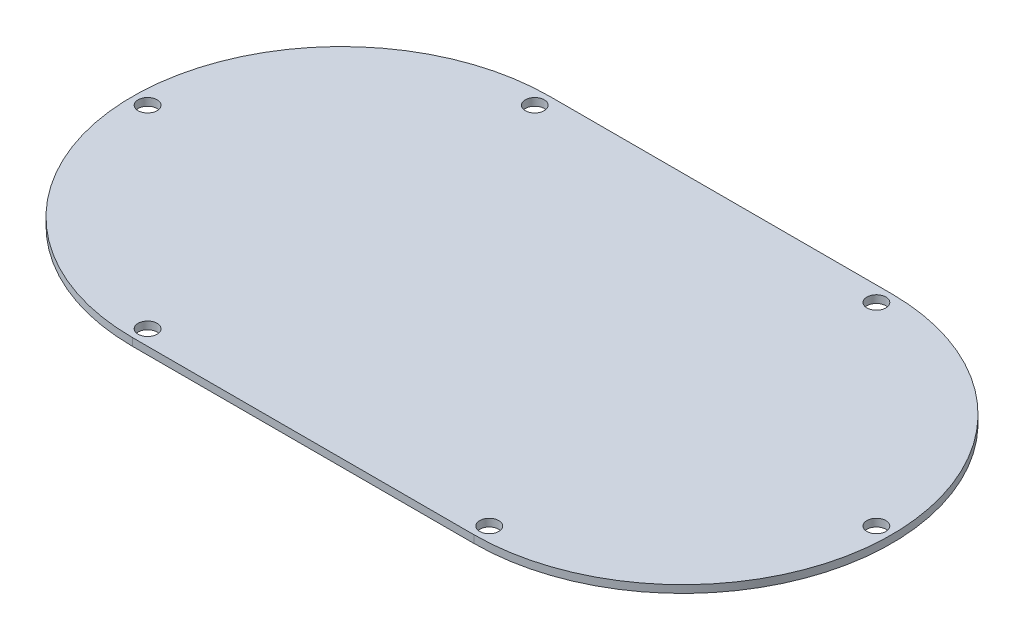
ISO-10303-21;
HEADER;
FILE_DESCRIPTION(('STEP AP214'),'2;1');
FILE_NAME('part.step','',(''),(''),'','','');
FILE_SCHEMA(('AUTOMOTIVE_DESIGN { 1 0 10303 214 1 1 1 1 }'));
ENDSEC;
DATA;
#1=APPLICATION_CONTEXT('core data for automotive mechanical design processes');
#2=APPLICATION_PROTOCOL_DEFINITION('international standard','automotive_design',2000,#1);
#3=PRODUCT_CONTEXT('',#1,'mechanical');
#4=PRODUCT('Part','Part','',(#3));
#5=PRODUCT_RELATED_PRODUCT_CATEGORY('part','',(#4));
#6=PRODUCT_DEFINITION_FORMATION('','',#4);
#7=PRODUCT_DEFINITION_CONTEXT('part definition',#1,'design');
#8=PRODUCT_DEFINITION('design','',#6,#7);
#9=PRODUCT_DEFINITION_SHAPE('','',#8);
#10=(LENGTH_UNIT() NAMED_UNIT(*) SI_UNIT(.MILLI.,.METRE.));
#11=(NAMED_UNIT(*) PLANE_ANGLE_UNIT() SI_UNIT($,.RADIAN.));
#12=(NAMED_UNIT(*) SI_UNIT($,.STERADIAN.) SOLID_ANGLE_UNIT());
#13=UNCERTAINTY_MEASURE_WITH_UNIT(LENGTH_MEASURE(1.E-05),#10,'distance_accuracy_value','');
#14=(GEOMETRIC_REPRESENTATION_CONTEXT(3) GLOBAL_UNCERTAINTY_ASSIGNED_CONTEXT((#13)) GLOBAL_UNIT_ASSIGNED_CONTEXT((#10,
#11,#12)) REPRESENTATION_CONTEXT('',''));
#15=CARTESIAN_POINT('',(0.,0.,0.));
#16=DIRECTION('',(0.,0.,1.));
#17=DIRECTION('',(1.,0.,0.));
#18=AXIS2_PLACEMENT_3D('',#15,#16,#17);
#19=CARTESIAN_POINT('',(-45.,2.,0.));
#20=DIRECTION('',(0.,1.,0.));
#21=DIRECTION('',(0.,0.,1.));
#22=AXIS2_PLACEMENT_3D('',#19,#20,#21);
#23=PLANE('',#22);
#24=CARTESIAN_POINT('',(45.,2.,51.));
#25=DIRECTION('',(0.,1.,0.));
#26=DIRECTION('',(0.,0.,1.));
#27=AXIS2_PLACEMENT_3D('',#24,#25,#26);
#28=CIRCLE('',#27,2.5);
#29=CARTESIAN_POINT('',(45.,2.,53.5));
#30=VERTEX_POINT('',#29);
#31=EDGE_CURVE('E135',#30,#30,#28,.T.);
#32=ORIENTED_EDGE('',*,*,#31,.F.);
#33=EDGE_LOOP('',(#32));
#34=FACE_BOUND('',#33,.T.);
#35=CARTESIAN_POINT('',(-45.,2.,-51.));
#36=DIRECTION('',(0.,1.,0.));
#37=DIRECTION('',(0.,0.,1.));
#38=AXIS2_PLACEMENT_3D('',#35,#36,#37);
#39=CIRCLE('',#38,2.5);
#40=CARTESIAN_POINT('',(-45.,2.,-48.5));
#41=VERTEX_POINT('',#40);
#42=EDGE_CURVE('E123',#41,#41,#39,.T.);
#43=ORIENTED_EDGE('',*,*,#42,.F.);
#44=EDGE_LOOP('',(#43));
#45=FACE_BOUND('',#44,.T.);
#46=CARTESIAN_POINT('',(-96.,2.,0.));
#47=DIRECTION('',(0.,1.,0.));
#48=DIRECTION('',(0.,0.,1.));
#49=AXIS2_PLACEMENT_3D('',#46,#47,#48);
#50=CIRCLE('',#49,2.5);
#51=CARTESIAN_POINT('',(-96.,2.,2.5));
#52=VERTEX_POINT('',#51);
#53=EDGE_CURVE('E102',#52,#52,#50,.T.);
#54=ORIENTED_EDGE('',*,*,#53,.F.);
#55=EDGE_LOOP('',(#54));
#56=FACE_BOUND('',#55,.T.);
#57=CARTESIAN_POINT('',(-45.,2.,0.));
#58=DIRECTION('',(0.,1.,0.));
#59=DIRECTION('',(0.,0.,1.));
#60=AXIS2_PLACEMENT_3D('',#57,#58,#59);
#61=CIRCLE('',#60,55.);
#62=CARTESIAN_POINT('',(-45.,2.,-55.));
#63=VERTEX_POINT('',#62);
#64=CARTESIAN_POINT('',(-45.,2.,55.));
#65=VERTEX_POINT('',#64);
#66=EDGE_CURVE('E87',#63,#65,#61,.T.);
#67=ORIENTED_EDGE('',*,*,#66,.T.);
#68=DIRECTION('',(1.,0.,0.));
#69=VECTOR('',#68,1.);
#70=CARTESIAN_POINT('',(-45.,2.,55.));
#71=LINE('',#70,#69);
#72=CARTESIAN_POINT('',(45.,2.,55.));
#73=VERTEX_POINT('',#72);
#74=EDGE_CURVE('E82',#65,#73,#71,.T.);
#75=ORIENTED_EDGE('',*,*,#74,.T.);
#76=CARTESIAN_POINT('',(45.,2.,0.));
#77=DIRECTION('',(0.,1.,0.));
#78=DIRECTION('',(0.,0.,1.));
#79=AXIS2_PLACEMENT_3D('',#76,#77,#78);
#80=CIRCLE('',#79,55.);
#81=CARTESIAN_POINT('',(45.,2.,-55.));
#82=VERTEX_POINT('',#81);
#83=EDGE_CURVE('E85',#73,#82,#80,.T.);
#84=ORIENTED_EDGE('',*,*,#83,.T.);
#85=DIRECTION('',(-1.,0.,0.));
#86=VECTOR('',#85,1.);
#87=CARTESIAN_POINT('',(-45.,2.,-55.));
#88=LINE('',#87,#86);
#89=EDGE_CURVE('E52',#82,#63,#88,.T.);
#90=ORIENTED_EDGE('',*,*,#89,.T.);
#91=EDGE_LOOP('',(#67,#75,#84,#90));
#92=FACE_BOUND('',#91,.T.);
#93=CARTESIAN_POINT('',(45.,2.,-51.));
#94=DIRECTION('',(0.,1.,0.));
#95=DIRECTION('',(0.,0.,-1.));
#96=AXIS2_PLACEMENT_3D('',#93,#94,#95);
#97=CIRCLE('',#96,2.5);
#98=CARTESIAN_POINT('',(45.,2.,-53.5));
#99=VERTEX_POINT('',#98);
#100=EDGE_CURVE('E117',#99,#99,#97,.T.);
#101=ORIENTED_EDGE('',*,*,#100,.F.);
#102=EDGE_LOOP('',(#101));
#103=FACE_BOUND('',#102,.T.);
#104=CARTESIAN_POINT('',(96.,2.,0.));
#105=DIRECTION('',(0.,1.,0.));
#106=DIRECTION('',(0.,0.,-1.));
#107=AXIS2_PLACEMENT_3D('',#104,#105,#106);
#108=CIRCLE('',#107,2.5);
#109=CARTESIAN_POINT('',(96.,2.,-2.5));
#110=VERTEX_POINT('',#109);
#111=EDGE_CURVE('E129',#110,#110,#108,.T.);
#112=ORIENTED_EDGE('',*,*,#111,.F.);
#113=EDGE_LOOP('',(#112));
#114=FACE_BOUND('',#113,.T.);
#115=CARTESIAN_POINT('',(-45.,2.,51.));
#116=DIRECTION('',(0.,1.,0.));
#117=DIRECTION('',(0.,0.,-1.));
#118=AXIS2_PLACEMENT_3D('',#115,#116,#117);
#119=CIRCLE('',#118,2.5);
#120=CARTESIAN_POINT('',(-45.,2.,48.5));
#121=VERTEX_POINT('',#120);
#122=EDGE_CURVE('E141',#121,#121,#119,.T.);
#123=ORIENTED_EDGE('',*,*,#122,.F.);
#124=EDGE_LOOP('',(#123));
#125=FACE_BOUND('',#124,.T.);
#126=ADVANCED_FACE('F35',(#34,#45,#56,#92,#103,#114,#125),#23,.T.);
#127=CARTESIAN_POINT('',(-45.,0.,0.));
#128=DIRECTION('',(0.,1.,0.));
#129=DIRECTION('',(0.,0.,1.));
#130=AXIS2_PLACEMENT_3D('',#127,#128,#129);
#131=PLANE('',#130);
#132=CARTESIAN_POINT('',(-45.,0.,0.));
#133=DIRECTION('',(0.,1.,0.));
#134=DIRECTION('',(0.,0.,1.));
#135=AXIS2_PLACEMENT_3D('',#132,#133,#134);
#136=CIRCLE('',#135,55.);
#137=CARTESIAN_POINT('',(-45.,0.,-55.));
#138=VERTEX_POINT('',#137);
#139=CARTESIAN_POINT('',(-45.,0.,55.));
#140=VERTEX_POINT('',#139);
#141=EDGE_CURVE('E99',#138,#140,#136,.T.);
#142=ORIENTED_EDGE('',*,*,#141,.F.);
#143=DIRECTION('',(-1.,0.,0.));
#144=VECTOR('',#143,1.);
#145=CARTESIAN_POINT('',(-45.,0.,-55.));
#146=LINE('',#145,#144);
#147=CARTESIAN_POINT('',(45.,0.,-55.));
#148=VERTEX_POINT('',#147);
#149=EDGE_CURVE('E75',#148,#138,#146,.T.);
#150=ORIENTED_EDGE('',*,*,#149,.F.);
#151=CARTESIAN_POINT('',(45.,0.,0.));
#152=DIRECTION('',(0.,1.,0.));
#153=DIRECTION('',(0.,0.,1.));
#154=AXIS2_PLACEMENT_3D('',#151,#152,#153);
#155=CIRCLE('',#154,55.);
#156=CARTESIAN_POINT('',(45.,0.,55.));
#157=VERTEX_POINT('',#156);
#158=EDGE_CURVE('E69',#157,#148,#155,.T.);
#159=ORIENTED_EDGE('',*,*,#158,.F.);
#160=DIRECTION('',(1.,0.,0.));
#161=VECTOR('',#160,1.);
#162=CARTESIAN_POINT('',(-45.,0.,55.));
#163=LINE('',#162,#161);
#164=EDGE_CURVE('E91',#140,#157,#163,.T.);
#165=ORIENTED_EDGE('',*,*,#164,.F.);
#166=EDGE_LOOP('',(#142,#150,#159,#165));
#167=FACE_BOUND('',#166,.T.);
#168=CARTESIAN_POINT('',(-96.,0.,0.));
#169=DIRECTION('',(0.,1.,0.));
#170=DIRECTION('',(0.,0.,1.));
#171=AXIS2_PLACEMENT_3D('',#168,#169,#170);
#172=CIRCLE('',#171,2.5);
#173=CARTESIAN_POINT('',(-96.,0.,2.5));
#174=VERTEX_POINT('',#173);
#175=EDGE_CURVE('E114',#174,#174,#172,.T.);
#176=ORIENTED_EDGE('',*,*,#175,.T.);
#177=EDGE_LOOP('',(#176));
#178=FACE_BOUND('',#177,.T.);
#179=CARTESIAN_POINT('',(45.,0.,-51.));
#180=DIRECTION('',(0.,1.,0.));
#181=DIRECTION('',(0.,0.,-1.));
#182=AXIS2_PLACEMENT_3D('',#179,#180,#181);
#183=CIRCLE('',#182,2.5);
#184=CARTESIAN_POINT('',(45.,0.,-53.5));
#185=VERTEX_POINT('',#184);
#186=EDGE_CURVE('E120',#185,#185,#183,.T.);
#187=ORIENTED_EDGE('',*,*,#186,.T.);
#188=EDGE_LOOP('',(#187));
#189=FACE_BOUND('',#188,.T.);
#190=CARTESIAN_POINT('',(-45.,0.,-51.));
#191=DIRECTION('',(0.,1.,0.));
#192=DIRECTION('',(0.,0.,1.));
#193=AXIS2_PLACEMENT_3D('',#190,#191,#192);
#194=CIRCLE('',#193,2.5);
#195=CARTESIAN_POINT('',(-45.,0.,-48.5));
#196=VERTEX_POINT('',#195);
#197=EDGE_CURVE('E126',#196,#196,#194,.T.);
#198=ORIENTED_EDGE('',*,*,#197,.T.);
#199=EDGE_LOOP('',(#198));
#200=FACE_BOUND('',#199,.T.);
#201=CARTESIAN_POINT('',(96.,0.,0.));
#202=DIRECTION('',(0.,1.,0.));
#203=DIRECTION('',(0.,0.,-1.));
#204=AXIS2_PLACEMENT_3D('',#201,#202,#203);
#205=CIRCLE('',#204,2.5);
#206=CARTESIAN_POINT('',(96.,0.,-2.5));
#207=VERTEX_POINT('',#206);
#208=EDGE_CURVE('E132',#207,#207,#205,.T.);
#209=ORIENTED_EDGE('',*,*,#208,.T.);
#210=EDGE_LOOP('',(#209));
#211=FACE_BOUND('',#210,.T.);
#212=CARTESIAN_POINT('',(45.,0.,51.));
#213=DIRECTION('',(0.,1.,0.));
#214=DIRECTION('',(0.,0.,1.));
#215=AXIS2_PLACEMENT_3D('',#212,#213,#214);
#216=CIRCLE('',#215,2.5);
#217=CARTESIAN_POINT('',(45.,0.,53.5));
#218=VERTEX_POINT('',#217);
#219=EDGE_CURVE('E138',#218,#218,#216,.T.);
#220=ORIENTED_EDGE('',*,*,#219,.T.);
#221=EDGE_LOOP('',(#220));
#222=FACE_BOUND('',#221,.T.);
#223=CARTESIAN_POINT('',(-45.,0.,51.));
#224=DIRECTION('',(0.,1.,0.));
#225=DIRECTION('',(0.,0.,-1.));
#226=AXIS2_PLACEMENT_3D('',#223,#224,#225);
#227=CIRCLE('',#226,2.5);
#228=CARTESIAN_POINT('',(-45.,0.,48.5));
#229=VERTEX_POINT('',#228);
#230=EDGE_CURVE('E144',#229,#229,#227,.T.);
#231=ORIENTED_EDGE('',*,*,#230,.T.);
#232=EDGE_LOOP('',(#231));
#233=FACE_BOUND('',#232,.T.);
#234=ADVANCED_FACE('F110',(#167,#178,#189,#200,#211,#222,#233),#131,.F.);
#235=CARTESIAN_POINT('',(-45.,2.,0.));
#236=DIRECTION('',(0.,-1.,0.));
#237=DIRECTION('',(0.,0.,-1.));
#238=AXIS2_PLACEMENT_3D('',#235,#236,#237);
#239=CYLINDRICAL_SURFACE('',#238,55.);
#240=ORIENTED_EDGE('',*,*,#141,.T.);
#241=DIRECTION('',(0.,-1.,0.));
#242=VECTOR('',#241,1.);
#243=CARTESIAN_POINT('',(-45.,2.,55.));
#244=LINE('',#243,#242);
#245=EDGE_CURVE('E11',#65,#140,#244,.T.);
#246=ORIENTED_EDGE('',*,*,#245,.F.);
#247=ORIENTED_EDGE('',*,*,#66,.F.);
#248=DIRECTION('',(0.,-1.,0.));
#249=VECTOR('',#248,1.);
#250=CARTESIAN_POINT('',(-45.,2.,-55.));
#251=LINE('',#250,#249);
#252=EDGE_CURVE('E95',#63,#138,#251,.T.);
#253=ORIENTED_EDGE('',*,*,#252,.T.);
#254=EDGE_LOOP('',(#240,#246,#247,#253));
#255=FACE_BOUND('',#254,.T.);
#256=ADVANCED_FACE('F37',(#255),#239,.T.);
#257=CARTESIAN_POINT('',(-45.,2.,55.));
#258=DIRECTION('',(0.,0.,-1.));
#259=DIRECTION('',(-1.,0.,0.));
#260=AXIS2_PLACEMENT_3D('',#257,#258,#259);
#261=PLANE('',#260);
#262=ORIENTED_EDGE('',*,*,#164,.T.);
#263=DIRECTION('',(0.,-1.,0.));
#264=VECTOR('',#263,1.);
#265=CARTESIAN_POINT('',(45.,2.,55.));
#266=LINE('',#265,#264);
#267=EDGE_CURVE('E44',#73,#157,#266,.T.);
#268=ORIENTED_EDGE('',*,*,#267,.F.);
#269=ORIENTED_EDGE('',*,*,#74,.F.);
#270=ORIENTED_EDGE('',*,*,#245,.T.);
#271=EDGE_LOOP('',(#262,#268,#269,#270));
#272=FACE_BOUND('',#271,.T.);
#273=ADVANCED_FACE('F90',(#272),#261,.F.);
#274=CARTESIAN_POINT('',(45.,2.,0.));
#275=DIRECTION('',(0.,-1.,0.));
#276=DIRECTION('',(0.,0.,-1.));
#277=AXIS2_PLACEMENT_3D('',#274,#275,#276);
#278=CYLINDRICAL_SURFACE('',#277,55.);
#279=ORIENTED_EDGE('',*,*,#158,.T.);
#280=DIRECTION('',(0.,-1.,0.));
#281=VECTOR('',#280,1.);
#282=CARTESIAN_POINT('',(45.,2.,-55.));
#283=LINE('',#282,#281);
#284=EDGE_CURVE('E92',#82,#148,#283,.T.);
#285=ORIENTED_EDGE('',*,*,#284,.F.);
#286=ORIENTED_EDGE('',*,*,#83,.F.);
#287=ORIENTED_EDGE('',*,*,#267,.T.);
#288=EDGE_LOOP('',(#279,#285,#286,#287));
#289=FACE_BOUND('',#288,.T.);
#290=ADVANCED_FACE('F93',(#289),#278,.T.);
#291=CARTESIAN_POINT('',(-45.,2.,-55.));
#292=DIRECTION('',(0.,0.,1.));
#293=DIRECTION('',(1.,0.,0.));
#294=AXIS2_PLACEMENT_3D('',#291,#292,#293);
#295=PLANE('',#294);
#296=ORIENTED_EDGE('',*,*,#149,.T.);
#297=ORIENTED_EDGE('',*,*,#252,.F.);
#298=ORIENTED_EDGE('',*,*,#89,.F.);
#299=ORIENTED_EDGE('',*,*,#284,.T.);
#300=EDGE_LOOP('',(#296,#297,#298,#299));
#301=FACE_BOUND('',#300,.T.);
#302=ADVANCED_FACE('F107',(#301),#295,.F.);
#303=CARTESIAN_POINT('',(-96.,2.,0.));
#304=DIRECTION('',(0.,-1.,0.));
#305=DIRECTION('',(0.,0.,-1.));
#306=AXIS2_PLACEMENT_3D('',#303,#304,#305);
#307=CYLINDRICAL_SURFACE('',#306,2.5);
#308=ORIENTED_EDGE('',*,*,#53,.T.);
#309=EDGE_LOOP('',(#308));
#310=FACE_BOUND('',#309,.T.);
#311=ORIENTED_EDGE('',*,*,#175,.F.);
#312=EDGE_LOOP('',(#311));
#313=FACE_BOUND('',#312,.T.);
#314=ADVANCED_FACE('F163',(#310,#313),#307,.F.);
#315=CARTESIAN_POINT('',(45.,2.,-51.));
#316=DIRECTION('',(0.,-1.,0.));
#317=DIRECTION('',(0.,0.,-1.));
#318=AXIS2_PLACEMENT_3D('',#315,#316,#317);
#319=CYLINDRICAL_SURFACE('',#318,2.5);
#320=ORIENTED_EDGE('',*,*,#100,.T.);
#321=EDGE_LOOP('',(#320));
#322=FACE_BOUND('',#321,.T.);
#323=ORIENTED_EDGE('',*,*,#186,.F.);
#324=EDGE_LOOP('',(#323));
#325=FACE_BOUND('',#324,.T.);
#326=ADVANCED_FACE('F209',(#322,#325),#319,.F.);
#327=CARTESIAN_POINT('',(-45.,2.,-51.));
#328=DIRECTION('',(0.,-1.,0.));
#329=DIRECTION('',(0.,0.,-1.));
#330=AXIS2_PLACEMENT_3D('',#327,#328,#329);
#331=CYLINDRICAL_SURFACE('',#330,2.5);
#332=ORIENTED_EDGE('',*,*,#42,.T.);
#333=EDGE_LOOP('',(#332));
#334=FACE_BOUND('',#333,.T.);
#335=ORIENTED_EDGE('',*,*,#197,.F.);
#336=EDGE_LOOP('',(#335));
#337=FACE_BOUND('',#336,.T.);
#338=ADVANCED_FACE('F217',(#334,#337),#331,.F.);
#339=CARTESIAN_POINT('',(96.,2.,0.));
#340=DIRECTION('',(0.,-1.,0.));
#341=DIRECTION('',(0.,0.,-1.));
#342=AXIS2_PLACEMENT_3D('',#339,#340,#341);
#343=CYLINDRICAL_SURFACE('',#342,2.5);
#344=ORIENTED_EDGE('',*,*,#111,.T.);
#345=EDGE_LOOP('',(#344));
#346=FACE_BOUND('',#345,.T.);
#347=ORIENTED_EDGE('',*,*,#208,.F.);
#348=EDGE_LOOP('',(#347));
#349=FACE_BOUND('',#348,.T.);
#350=ADVANCED_FACE('F225',(#346,#349),#343,.F.);
#351=CARTESIAN_POINT('',(45.,2.,51.));
#352=DIRECTION('',(0.,-1.,0.));
#353=DIRECTION('',(0.,0.,-1.));
#354=AXIS2_PLACEMENT_3D('',#351,#352,#353);
#355=CYLINDRICAL_SURFACE('',#354,2.5);
#356=ORIENTED_EDGE('',*,*,#31,.T.);
#357=EDGE_LOOP('',(#356));
#358=FACE_BOUND('',#357,.T.);
#359=ORIENTED_EDGE('',*,*,#219,.F.);
#360=EDGE_LOOP('',(#359));
#361=FACE_BOUND('',#360,.T.);
#362=ADVANCED_FACE('F234',(#358,#361),#355,.F.);
#363=CARTESIAN_POINT('',(-45.,2.,51.));
#364=DIRECTION('',(0.,-1.,0.));
#365=DIRECTION('',(0.,0.,-1.));
#366=AXIS2_PLACEMENT_3D('',#363,#364,#365);
#367=CYLINDRICAL_SURFACE('',#366,2.5);
#368=ORIENTED_EDGE('',*,*,#122,.T.);
#369=EDGE_LOOP('',(#368));
#370=FACE_BOUND('',#369,.T.);
#371=ORIENTED_EDGE('',*,*,#230,.F.);
#372=EDGE_LOOP('',(#371));
#373=FACE_BOUND('',#372,.T.);
#374=ADVANCED_FACE('F150',(#370,#373),#367,.F.);
#375=CLOSED_SHELL('',(#126,#234,#256,#273,#290,#302,#314,#326,#338,#350,#362,#374));
#376=MANIFOLD_SOLID_BREP('B2',#375);
#377=ADVANCED_BREP_SHAPE_REPRESENTATION('',(#18,#376),#14);
#378=SHAPE_DEFINITION_REPRESENTATION(#9,#377);
ENDSEC;
END-ISO-10303-21;
